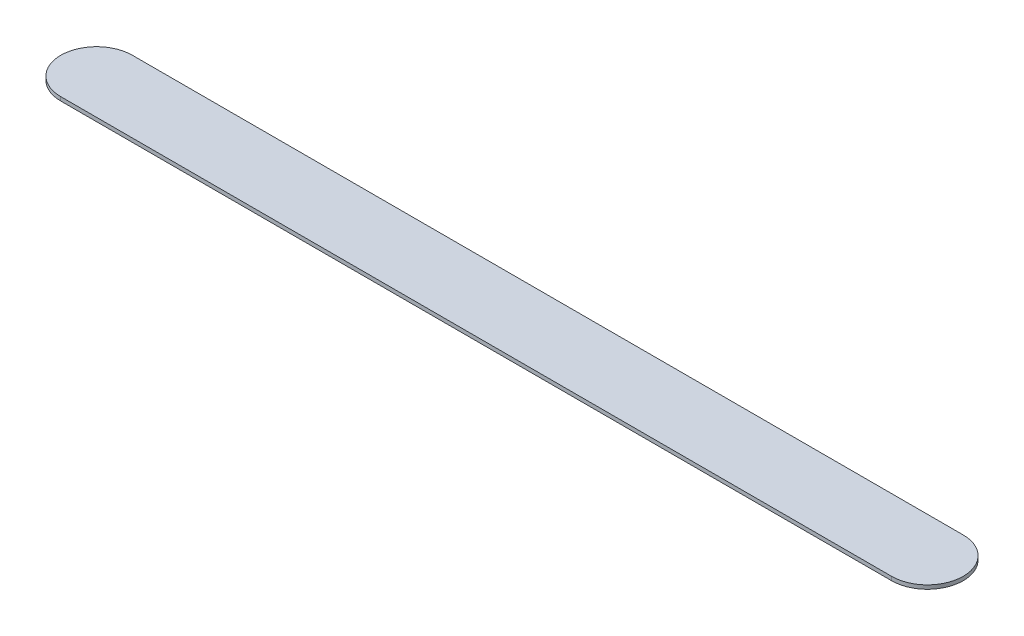
ISO-10303-21;
HEADER;
FILE_DESCRIPTION(('STEP AP214'),'2;1');
FILE_NAME('part.step','',(''),(''),'','','');
FILE_SCHEMA(('AUTOMOTIVE_DESIGN { 1 0 10303 214 1 1 1 1 }'));
ENDSEC;
DATA;
#1=APPLICATION_CONTEXT('core data for automotive mechanical design processes');
#2=APPLICATION_PROTOCOL_DEFINITION('international standard','automotive_design',2000,#1);
#3=PRODUCT_CONTEXT('',#1,'mechanical');
#4=PRODUCT('Part','Part','',(#3));
#5=PRODUCT_RELATED_PRODUCT_CATEGORY('part','',(#4));
#6=PRODUCT_DEFINITION_FORMATION('','',#4);
#7=PRODUCT_DEFINITION_CONTEXT('part definition',#1,'design');
#8=PRODUCT_DEFINITION('design','',#6,#7);
#9=PRODUCT_DEFINITION_SHAPE('','',#8);
#10=(LENGTH_UNIT() NAMED_UNIT(*) SI_UNIT(.MILLI.,.METRE.));
#11=(NAMED_UNIT(*) PLANE_ANGLE_UNIT() SI_UNIT($,.RADIAN.));
#12=(NAMED_UNIT(*) SI_UNIT($,.STERADIAN.) SOLID_ANGLE_UNIT());
#13=UNCERTAINTY_MEASURE_WITH_UNIT(LENGTH_MEASURE(1.E-05),#10,'distance_accuracy_value','');
#14=(GEOMETRIC_REPRESENTATION_CONTEXT(3) GLOBAL_UNCERTAINTY_ASSIGNED_CONTEXT((#13)) GLOBAL_UNIT_ASSIGNED_CONTEXT((#10,
#11,#12)) REPRESENTATION_CONTEXT('',''));
#15=CARTESIAN_POINT('',(0.,0.,0.));
#16=DIRECTION('',(0.,0.,1.));
#17=DIRECTION('',(1.,0.,0.));
#18=AXIS2_PLACEMENT_3D('',#15,#16,#17);
#19=CARTESIAN_POINT('',(0.,-0.7366,0.));
#20=DIRECTION('',(0.,1.,0.));
#21=DIRECTION('',(0.,0.,1.));
#22=AXIS2_PLACEMENT_3D('',#19,#20,#21);
#23=CYLINDRICAL_SURFACE('',#22,6.9);
#24=CARTESIAN_POINT('',(0.,0.,0.));
#25=DIRECTION('',(0.,1.,0.));
#26=DIRECTION('',(0.,0.,1.));
#27=AXIS2_PLACEMENT_3D('',#24,#25,#26);
#28=CIRCLE('',#27,6.9);
#29=CARTESIAN_POINT('',(0.,0.,-6.9));
#30=VERTEX_POINT('',#29);
#31=CARTESIAN_POINT('',(0.,0.,6.9));
#32=VERTEX_POINT('',#31);
#33=EDGE_CURVE('E103',#30,#32,#28,.T.);
#34=ORIENTED_EDGE('',*,*,#33,.F.);
#35=DIRECTION('',(0.,1.,0.));
#36=VECTOR('',#35,1.);
#37=CARTESIAN_POINT('',(0.,-0.7366,-6.9));
#38=LINE('',#37,#36);
#39=CARTESIAN_POINT('',(0.,-0.7366,-6.9));
#40=VERTEX_POINT('',#39);
#41=EDGE_CURVE('E12',#40,#30,#38,.T.);
#42=ORIENTED_EDGE('',*,*,#41,.F.);
#43=CARTESIAN_POINT('',(0.,-0.7366,0.));
#44=DIRECTION('',(0.,1.,0.));
#45=DIRECTION('',(0.,0.,1.));
#46=AXIS2_PLACEMENT_3D('',#43,#44,#45);
#47=CIRCLE('',#46,6.9);
#48=CARTESIAN_POINT('',(0.,-0.7366,6.9));
#49=VERTEX_POINT('',#48);
#50=EDGE_CURVE('E97',#40,#49,#47,.T.);
#51=ORIENTED_EDGE('',*,*,#50,.T.);
#52=DIRECTION('',(0.,1.,0.));
#53=VECTOR('',#52,1.);
#54=CARTESIAN_POINT('',(0.,-0.7366,6.9));
#55=LINE('',#54,#53);
#56=EDGE_CURVE('E42',#49,#32,#55,.T.);
#57=ORIENTED_EDGE('',*,*,#56,.T.);
#58=EDGE_LOOP('',(#34,#42,#51,#57));
#59=FACE_BOUND('',#58,.T.);
#60=ADVANCED_FACE('F39',(#59),#23,.T.);
#61=CARTESIAN_POINT('',(0.,-0.7366,-6.9));
#62=DIRECTION('',(0.,0.,-1.));
#63=DIRECTION('',(-1.,0.,0.));
#64=AXIS2_PLACEMENT_3D('',#61,#62,#63);
#65=PLANE('',#64);
#66=DIRECTION('',(-1.,0.,0.));
#67=VECTOR('',#66,1.);
#68=CARTESIAN_POINT('',(0.,0.,-6.9));
#69=LINE('',#68,#67);
#70=CARTESIAN_POINT('',(160.,0.,-6.9));
#71=VERTEX_POINT('',#70);
#72=EDGE_CURVE('E99',#71,#30,#69,.T.);
#73=ORIENTED_EDGE('',*,*,#72,.F.);
#74=DIRECTION('',(0.,1.,0.));
#75=VECTOR('',#74,1.);
#76=CARTESIAN_POINT('',(160.,-0.7366,-6.9));
#77=LINE('',#76,#75);
#78=CARTESIAN_POINT('',(160.,-0.7366,-6.9));
#79=VERTEX_POINT('',#78);
#80=EDGE_CURVE('E48',#79,#71,#77,.T.);
#81=ORIENTED_EDGE('',*,*,#80,.F.);
#82=DIRECTION('',(-1.,0.,0.));
#83=VECTOR('',#82,1.);
#84=CARTESIAN_POINT('',(0.,-0.7366,-6.9));
#85=LINE('',#84,#83);
#86=EDGE_CURVE('E94',#79,#40,#85,.T.);
#87=ORIENTED_EDGE('',*,*,#86,.T.);
#88=ORIENTED_EDGE('',*,*,#41,.T.);
#89=EDGE_LOOP('',(#73,#81,#87,#88));
#90=FACE_BOUND('',#89,.T.);
#91=ADVANCED_FACE('F121',(#90),#65,.T.);
#92=CARTESIAN_POINT('',(160.,-0.7366,0.));
#93=DIRECTION('',(0.,1.,0.));
#94=DIRECTION('',(0.,0.,1.));
#95=AXIS2_PLACEMENT_3D('',#92,#93,#94);
#96=CYLINDRICAL_SURFACE('',#95,6.9);
#97=CARTESIAN_POINT('',(160.,0.,0.));
#98=DIRECTION('',(0.,1.,0.));
#99=DIRECTION('',(0.,0.,1.));
#100=AXIS2_PLACEMENT_3D('',#97,#98,#99);
#101=CIRCLE('',#100,6.9);
#102=CARTESIAN_POINT('',(160.,0.,6.9));
#103=VERTEX_POINT('',#102);
#104=EDGE_CURVE('E89',#103,#71,#101,.T.);
#105=ORIENTED_EDGE('',*,*,#104,.F.);
#106=DIRECTION('',(0.,1.,0.));
#107=VECTOR('',#106,1.);
#108=CARTESIAN_POINT('',(160.,-0.7366,6.9));
#109=LINE('',#108,#107);
#110=CARTESIAN_POINT('',(160.,-0.7366,6.9));
#111=VERTEX_POINT('',#110);
#112=EDGE_CURVE('E84',#111,#103,#109,.T.);
#113=ORIENTED_EDGE('',*,*,#112,.F.);
#114=CARTESIAN_POINT('',(160.,-0.7366,0.));
#115=DIRECTION('',(0.,1.,0.));
#116=DIRECTION('',(0.,0.,1.));
#117=AXIS2_PLACEMENT_3D('',#114,#115,#116);
#118=CIRCLE('',#117,6.9);
#119=EDGE_CURVE('E87',#111,#79,#118,.T.);
#120=ORIENTED_EDGE('',*,*,#119,.T.);
#121=ORIENTED_EDGE('',*,*,#80,.T.);
#122=EDGE_LOOP('',(#105,#113,#120,#121));
#123=FACE_BOUND('',#122,.T.);
#124=ADVANCED_FACE('F86',(#123),#96,.T.);
#125=CARTESIAN_POINT('',(0.,-0.7366,6.9));
#126=DIRECTION('',(0.,0.,1.));
#127=DIRECTION('',(1.,0.,0.));
#128=AXIS2_PLACEMENT_3D('',#125,#126,#127);
#129=PLANE('',#128);
#130=DIRECTION('',(1.,0.,0.));
#131=VECTOR('',#130,1.);
#132=CARTESIAN_POINT('',(0.,0.,6.9));
#133=LINE('',#132,#131);
#134=EDGE_CURVE('E108',#32,#103,#133,.T.);
#135=ORIENTED_EDGE('',*,*,#134,.F.);
#136=ORIENTED_EDGE('',*,*,#56,.F.);
#137=DIRECTION('',(1.,0.,0.));
#138=VECTOR('',#137,1.);
#139=CARTESIAN_POINT('',(0.,-0.7366,6.9));
#140=LINE('',#139,#138);
#141=EDGE_CURVE('E93',#49,#111,#140,.T.);
#142=ORIENTED_EDGE('',*,*,#141,.T.);
#143=ORIENTED_EDGE('',*,*,#112,.T.);
#144=EDGE_LOOP('',(#135,#136,#142,#143));
#145=FACE_BOUND('',#144,.T.);
#146=ADVANCED_FACE('F96',(#145),#129,.T.);
#147=CARTESIAN_POINT('',(0.,-0.7366,0.));
#148=DIRECTION('',(0.,1.,0.));
#149=DIRECTION('',(0.,0.,1.));
#150=AXIS2_PLACEMENT_3D('',#147,#148,#149);
#151=PLANE('',#150);
#152=ORIENTED_EDGE('',*,*,#50,.F.);
#153=ORIENTED_EDGE('',*,*,#86,.F.);
#154=ORIENTED_EDGE('',*,*,#119,.F.);
#155=ORIENTED_EDGE('',*,*,#141,.F.);
#156=EDGE_LOOP('',(#152,#153,#154,#155));
#157=FACE_BOUND('',#156,.T.);
#158=ADVANCED_FACE('F92',(#157),#151,.F.);
#159=CARTESIAN_POINT('',(0.,0.,0.));
#160=DIRECTION('',(0.,1.,0.));
#161=DIRECTION('',(0.,0.,1.));
#162=AXIS2_PLACEMENT_3D('',#159,#160,#161);
#163=PLANE('',#162);
#164=ORIENTED_EDGE('',*,*,#33,.T.);
#165=ORIENTED_EDGE('',*,*,#134,.T.);
#166=ORIENTED_EDGE('',*,*,#104,.T.);
#167=ORIENTED_EDGE('',*,*,#72,.T.);
#168=EDGE_LOOP('',(#164,#165,#166,#167));
#169=FACE_BOUND('',#168,.T.);
#170=ADVANCED_FACE('F120',(#169),#163,.T.);
#171=CLOSED_SHELL('',(#60,#91,#124,#146,#158,#170));
#172=MANIFOLD_SOLID_BREP('B2',#171);
#173=ADVANCED_BREP_SHAPE_REPRESENTATION('',(#18,#172),#14);
#174=SHAPE_DEFINITION_REPRESENTATION(#9,#173);
ENDSEC;
END-ISO-10303-21;
